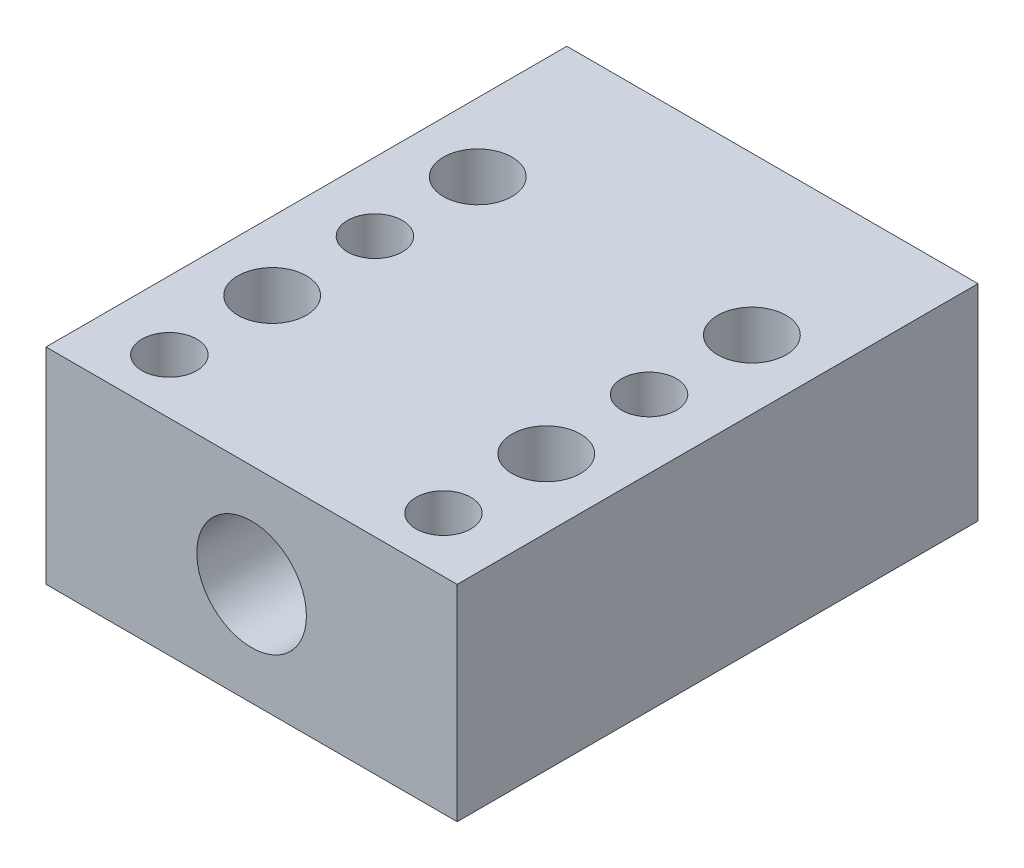
ISO-10303-21;
HEADER;
FILE_DESCRIPTION(('STEP AP214'),'2;1');
FILE_NAME('part.step','',(''),(''),'','','');
FILE_SCHEMA(('AUTOMOTIVE_DESIGN { 1 0 10303 214 1 1 1 1 }'));
ENDSEC;
DATA;
#1=APPLICATION_CONTEXT('core data for automotive mechanical design processes');
#2=APPLICATION_PROTOCOL_DEFINITION('international standard','automotive_design',2000,#1);
#3=PRODUCT_CONTEXT('',#1,'mechanical');
#4=PRODUCT('Part','Part','',(#3));
#5=PRODUCT_RELATED_PRODUCT_CATEGORY('part','',(#4));
#6=PRODUCT_DEFINITION_FORMATION('','',#4);
#7=PRODUCT_DEFINITION_CONTEXT('part definition',#1,'design');
#8=PRODUCT_DEFINITION('design','',#6,#7);
#9=PRODUCT_DEFINITION_SHAPE('','',#8);
#10=(LENGTH_UNIT() NAMED_UNIT(*) SI_UNIT(.MILLI.,.METRE.));
#11=(NAMED_UNIT(*) PLANE_ANGLE_UNIT() SI_UNIT($,.RADIAN.));
#12=(NAMED_UNIT(*) SI_UNIT($,.STERADIAN.) SOLID_ANGLE_UNIT());
#13=UNCERTAINTY_MEASURE_WITH_UNIT(LENGTH_MEASURE(1.E-05),#10,'distance_accuracy_value','');
#14=(GEOMETRIC_REPRESENTATION_CONTEXT(3) GLOBAL_UNCERTAINTY_ASSIGNED_CONTEXT((#13)) GLOBAL_UNIT_ASSIGNED_CONTEXT((#10,
#11,#12)) REPRESENTATION_CONTEXT('',''));
#15=CARTESIAN_POINT('',(0.,0.,0.));
#16=DIRECTION('',(0.,0.,1.));
#17=DIRECTION('',(1.,0.,0.));
#18=AXIS2_PLACEMENT_3D('',#15,#16,#17);
#19=CARTESIAN_POINT('',(0.,0.,38.));
#20=DIRECTION('',(0.,0.,1.));
#21=DIRECTION('',(1.,0.,0.));
#22=AXIS2_PLACEMENT_3D('',#19,#20,#21);
#23=PLANE('',#22);
#24=DIRECTION('',(0.,1.,0.));
#25=VECTOR('',#24,1.);
#26=CARTESIAN_POINT('',(15.,7.5,38.));
#27=LINE('',#26,#25);
#28=CARTESIAN_POINT('',(15.,-7.5,38.));
#29=VERTEX_POINT('',#28);
#30=CARTESIAN_POINT('',(15.,7.5,38.));
#31=VERTEX_POINT('',#30);
#32=EDGE_CURVE('E92',#29,#31,#27,.T.);
#33=ORIENTED_EDGE('',*,*,#32,.T.);
#34=DIRECTION('',(-1.,0.,0.));
#35=VECTOR('',#34,1.);
#36=CARTESIAN_POINT('',(-15.,7.5,38.));
#37=LINE('',#36,#35);
#38=CARTESIAN_POINT('',(-15.,7.5,38.));
#39=VERTEX_POINT('',#38);
#40=EDGE_CURVE('E87',#31,#39,#37,.T.);
#41=ORIENTED_EDGE('',*,*,#40,.T.);
#42=DIRECTION('',(0.,-1.,0.));
#43=VECTOR('',#42,1.);
#44=CARTESIAN_POINT('',(-15.,7.5,38.));
#45=LINE('',#44,#43);
#46=CARTESIAN_POINT('',(-15.,-7.5,38.));
#47=VERTEX_POINT('',#46);
#48=EDGE_CURVE('E90',#39,#47,#45,.T.);
#49=ORIENTED_EDGE('',*,*,#48,.T.);
#50=DIRECTION('',(1.,0.,0.));
#51=VECTOR('',#50,1.);
#52=CARTESIAN_POINT('',(-15.,-7.5,38.));
#53=LINE('',#52,#51);
#54=EDGE_CURVE('E57',#47,#29,#53,.T.);
#55=ORIENTED_EDGE('',*,*,#54,.T.);
#56=EDGE_LOOP('',(#33,#41,#49,#55));
#57=FACE_BOUND('',#56,.T.);
#58=CARTESIAN_POINT('',(0.,0.,38.));
#59=DIRECTION('',(0.,0.,1.));
#60=DIRECTION('',(1.,0.,0.));
#61=AXIS2_PLACEMENT_3D('',#58,#59,#60);
#62=CIRCLE('',#61,4.);
#63=CARTESIAN_POINT('',(4.,0.,38.));
#64=VERTEX_POINT('',#63);
#65=EDGE_CURVE('E112',#64,#64,#62,.T.);
#66=ORIENTED_EDGE('',*,*,#65,.F.);
#67=EDGE_LOOP('',(#66));
#68=FACE_BOUND('',#67,.T.);
#69=ADVANCED_FACE('F39',(#57,#68),#23,.T.);
#70=CARTESIAN_POINT('',(0.,0.,0.));
#71=DIRECTION('',(0.,0.,1.));
#72=DIRECTION('',(1.,0.,0.));
#73=AXIS2_PLACEMENT_3D('',#70,#71,#72);
#74=PLANE('',#73);
#75=DIRECTION('',(0.,1.,0.));
#76=VECTOR('',#75,1.);
#77=CARTESIAN_POINT('',(15.,7.5,0.));
#78=LINE('',#77,#76);
#79=CARTESIAN_POINT('',(15.,-7.5,0.));
#80=VERTEX_POINT('',#79);
#81=CARTESIAN_POINT('',(15.,7.5,0.));
#82=VERTEX_POINT('',#81);
#83=EDGE_CURVE('E108',#80,#82,#78,.T.);
#84=ORIENTED_EDGE('',*,*,#83,.F.);
#85=DIRECTION('',(1.,0.,0.));
#86=VECTOR('',#85,1.);
#87=CARTESIAN_POINT('',(-15.,-7.5,0.));
#88=LINE('',#87,#86);
#89=CARTESIAN_POINT('',(-15.,-7.5,0.));
#90=VERTEX_POINT('',#89);
#91=EDGE_CURVE('E80',#90,#80,#88,.T.);
#92=ORIENTED_EDGE('',*,*,#91,.F.);
#93=DIRECTION('',(0.,-1.,0.));
#94=VECTOR('',#93,1.);
#95=CARTESIAN_POINT('',(-15.,7.5,0.));
#96=LINE('',#95,#94);
#97=CARTESIAN_POINT('',(-15.,7.5,0.));
#98=VERTEX_POINT('',#97);
#99=EDGE_CURVE('E74',#98,#90,#96,.T.);
#100=ORIENTED_EDGE('',*,*,#99,.F.);
#101=DIRECTION('',(-1.,0.,0.));
#102=VECTOR('',#101,1.);
#103=CARTESIAN_POINT('',(-15.,7.5,0.));
#104=LINE('',#103,#102);
#105=EDGE_CURVE('E97',#82,#98,#104,.T.);
#106=ORIENTED_EDGE('',*,*,#105,.F.);
#107=EDGE_LOOP('',(#84,#92,#100,#106));
#108=FACE_BOUND('',#107,.T.);
#109=CARTESIAN_POINT('',(0.,0.,0.));
#110=DIRECTION('',(0.,0.,1.));
#111=DIRECTION('',(1.,0.,0.));
#112=AXIS2_PLACEMENT_3D('',#109,#110,#111);
#113=CIRCLE('',#112,4.);
#114=CARTESIAN_POINT('',(4.,0.,0.));
#115=VERTEX_POINT('',#114);
#116=EDGE_CURVE('E130',#115,#115,#113,.T.);
#117=ORIENTED_EDGE('',*,*,#116,.T.);
#118=EDGE_LOOP('',(#117));
#119=FACE_BOUND('',#118,.T.);
#120=ADVANCED_FACE('F125',(#108,#119),#74,.F.);
#121=CARTESIAN_POINT('',(15.,7.5,38.));
#122=DIRECTION('',(-1.,0.,0.));
#123=DIRECTION('',(0.,-1.,0.));
#124=AXIS2_PLACEMENT_3D('',#121,#122,#123);
#125=PLANE('',#124);
#126=ORIENTED_EDGE('',*,*,#83,.T.);
#127=DIRECTION('',(0.,0.,-1.));
#128=VECTOR('',#127,1.);
#129=CARTESIAN_POINT('',(15.,7.5,38.));
#130=LINE('',#129,#128);
#131=EDGE_CURVE('E11',#31,#82,#130,.T.);
#132=ORIENTED_EDGE('',*,*,#131,.F.);
#133=ORIENTED_EDGE('',*,*,#32,.F.);
#134=DIRECTION('',(0.,0.,-1.));
#135=VECTOR('',#134,1.);
#136=CARTESIAN_POINT('',(15.,-7.5,38.));
#137=LINE('',#136,#135);
#138=EDGE_CURVE('E104',#29,#80,#137,.T.);
#139=ORIENTED_EDGE('',*,*,#138,.T.);
#140=EDGE_LOOP('',(#126,#132,#133,#139));
#141=FACE_BOUND('',#140,.T.);
#142=ADVANCED_FACE('F41',(#141),#125,.F.);
#143=CARTESIAN_POINT('',(-15.,7.5,38.));
#144=DIRECTION('',(0.,-1.,0.));
#145=DIRECTION('',(0.,0.,-1.));
#146=AXIS2_PLACEMENT_3D('',#143,#144,#145);
#147=PLANE('',#146);
#148=CARTESIAN_POINT('',(-9.99999999999999,7.5,34.));
#149=DIRECTION('',(0.,1.,0.));
#150=DIRECTION('',(0.,0.,1.));
#151=AXIS2_PLACEMENT_3D('',#148,#149,#150);
#152=CIRCLE('',#151,2.);
#153=CARTESIAN_POINT('',(-9.99999999999999,7.5,36.));
#154=VERTEX_POINT('',#153);
#155=EDGE_CURVE('E162',#154,#154,#152,.T.);
#156=ORIENTED_EDGE('',*,*,#155,.F.);
#157=EDGE_LOOP('',(#156));
#158=FACE_BOUND('',#157,.T.);
#159=CARTESIAN_POINT('',(-9.99999999999999,7.5,26.5));
#160=DIRECTION('',(0.,1.,0.));
#161=DIRECTION('',(0.,0.,1.));
#162=AXIS2_PLACEMENT_3D('',#159,#160,#161);
#163=CIRCLE('',#162,2.5);
#164=CARTESIAN_POINT('',(-9.99999999999999,7.5,29.));
#165=VERTEX_POINT('',#164);
#166=EDGE_CURVE('E171',#165,#165,#163,.T.);
#167=ORIENTED_EDGE('',*,*,#166,.F.);
#168=EDGE_LOOP('',(#167));
#169=FACE_BOUND('',#168,.T.);
#170=CARTESIAN_POINT('',(10.,7.5,26.5));
#171=DIRECTION('',(0.,1.,0.));
#172=DIRECTION('',(0.,0.,1.));
#173=AXIS2_PLACEMENT_3D('',#170,#171,#172);
#174=CIRCLE('',#173,2.5);
#175=CARTESIAN_POINT('',(10.,7.5,29.));
#176=VERTEX_POINT('',#175);
#177=EDGE_CURVE('E146',#176,#176,#174,.T.);
#178=ORIENTED_EDGE('',*,*,#177,.F.);
#179=EDGE_LOOP('',(#178));
#180=FACE_BOUND('',#179,.T.);
#181=CARTESIAN_POINT('',(-10.,7.5,19.));
#182=DIRECTION('',(0.,1.,0.));
#183=DIRECTION('',(0.,0.,1.));
#184=AXIS2_PLACEMENT_3D('',#181,#182,#183);
#185=CIRCLE('',#184,2.);
#186=CARTESIAN_POINT('',(-10.,7.5,21.));
#187=VERTEX_POINT('',#186);
#188=EDGE_CURVE('E155',#187,#187,#185,.T.);
#189=ORIENTED_EDGE('',*,*,#188,.F.);
#190=EDGE_LOOP('',(#189));
#191=FACE_BOUND('',#190,.T.);
#192=CARTESIAN_POINT('',(10.,7.5,34.));
#193=DIRECTION('',(0.,1.,0.));
#194=DIRECTION('',(0.,0.,1.));
#195=AXIS2_PLACEMENT_3D('',#192,#193,#194);
#196=CIRCLE('',#195,2.);
#197=CARTESIAN_POINT('',(10.,7.5,36.));
#198=VERTEX_POINT('',#197);
#199=EDGE_CURVE('E194',#198,#198,#196,.T.);
#200=ORIENTED_EDGE('',*,*,#199,.F.);
#201=EDGE_LOOP('',(#200));
#202=FACE_BOUND('',#201,.T.);
#203=CARTESIAN_POINT('',(10.,7.5,11.5));
#204=DIRECTION('',(0.,1.,0.));
#205=DIRECTION('',(0.,0.,1.));
#206=AXIS2_PLACEMENT_3D('',#203,#204,#205);
#207=CIRCLE('',#206,2.5);
#208=CARTESIAN_POINT('',(10.,7.5,14.));
#209=VERTEX_POINT('',#208);
#210=EDGE_CURVE('E186',#209,#209,#207,.T.);
#211=ORIENTED_EDGE('',*,*,#210,.F.);
#212=EDGE_LOOP('',(#211));
#213=FACE_BOUND('',#212,.T.);
#214=CARTESIAN_POINT('',(-10.,7.5,11.5));
#215=DIRECTION('',(0.,1.,0.));
#216=DIRECTION('',(0.,0.,1.));
#217=AXIS2_PLACEMENT_3D('',#214,#215,#216);
#218=CIRCLE('',#217,2.5);
#219=CARTESIAN_POINT('',(-10.,7.5,14.));
#220=VERTEX_POINT('',#219);
#221=EDGE_CURVE('E178',#220,#220,#218,.T.);
#222=ORIENTED_EDGE('',*,*,#221,.F.);
#223=EDGE_LOOP('',(#222));
#224=FACE_BOUND('',#223,.T.);
#225=CARTESIAN_POINT('',(10.,7.5,19.));
#226=DIRECTION('',(0.,1.,0.));
#227=DIRECTION('',(0.,0.,1.));
#228=AXIS2_PLACEMENT_3D('',#225,#226,#227);
#229=CIRCLE('',#228,2.);
#230=CARTESIAN_POINT('',(10.,7.5,21.));
#231=VERTEX_POINT('',#230);
#232=EDGE_CURVE('E138',#231,#231,#229,.T.);
#233=ORIENTED_EDGE('',*,*,#232,.F.);
#234=EDGE_LOOP('',(#233));
#235=FACE_BOUND('',#234,.T.);
#236=ORIENTED_EDGE('',*,*,#105,.T.);
#237=DIRECTION('',(0.,0.,-1.));
#238=VECTOR('',#237,1.);
#239=CARTESIAN_POINT('',(-15.,7.5,38.));
#240=LINE('',#239,#238);
#241=EDGE_CURVE('E49',#39,#98,#240,.T.);
#242=ORIENTED_EDGE('',*,*,#241,.F.);
#243=ORIENTED_EDGE('',*,*,#40,.F.);
#244=ORIENTED_EDGE('',*,*,#131,.T.);
#245=EDGE_LOOP('',(#236,#242,#243,#244));
#246=FACE_BOUND('',#245,.T.);
#247=ADVANCED_FACE('F96',(#158,#169,#180,#191,#202,#213,#224,#235,#246),#147,.F.);
#248=CARTESIAN_POINT('',(-15.,7.5,38.));
#249=DIRECTION('',(1.,0.,0.));
#250=DIRECTION('',(0.,1.,0.));
#251=AXIS2_PLACEMENT_3D('',#248,#249,#250);
#252=PLANE('',#251);
#253=ORIENTED_EDGE('',*,*,#99,.T.);
#254=DIRECTION('',(0.,0.,-1.));
#255=VECTOR('',#254,1.);
#256=CARTESIAN_POINT('',(-15.,-7.5,38.));
#257=LINE('',#256,#255);
#258=EDGE_CURVE('E99',#47,#90,#257,.T.);
#259=ORIENTED_EDGE('',*,*,#258,.F.);
#260=ORIENTED_EDGE('',*,*,#48,.F.);
#261=ORIENTED_EDGE('',*,*,#241,.T.);
#262=EDGE_LOOP('',(#253,#259,#260,#261));
#263=FACE_BOUND('',#262,.T.);
#264=ADVANCED_FACE('F100',(#263),#252,.F.);
#265=CARTESIAN_POINT('',(-15.,-7.5,38.));
#266=DIRECTION('',(0.,1.,0.));
#267=DIRECTION('',(0.,0.,1.));
#268=AXIS2_PLACEMENT_3D('',#265,#266,#267);
#269=PLANE('',#268);
#270=ORIENTED_EDGE('',*,*,#91,.T.);
#271=ORIENTED_EDGE('',*,*,#138,.F.);
#272=ORIENTED_EDGE('',*,*,#54,.F.);
#273=ORIENTED_EDGE('',*,*,#258,.T.);
#274=EDGE_LOOP('',(#270,#271,#272,#273));
#275=FACE_BOUND('',#274,.T.);
#276=ADVANCED_FACE('F122',(#275),#269,.F.);
#277=CARTESIAN_POINT('',(0.,0.,38.));
#278=DIRECTION('',(0.,0.,-1.));
#279=DIRECTION('',(-1.,0.,0.));
#280=AXIS2_PLACEMENT_3D('',#277,#278,#279);
#281=CYLINDRICAL_SURFACE('',#280,4.);
#282=ORIENTED_EDGE('',*,*,#65,.T.);
#283=EDGE_LOOP('',(#282));
#284=FACE_BOUND('',#283,.T.);
#285=ORIENTED_EDGE('',*,*,#116,.F.);
#286=EDGE_LOOP('',(#285));
#287=FACE_BOUND('',#286,.T.);
#288=ADVANCED_FACE('F223',(#284,#287),#281,.F.);
#289=CARTESIAN_POINT('',(10.,1.5,19.));
#290=DIRECTION('',(0.,1.,0.));
#291=DIRECTION('',(0.,0.,1.));
#292=AXIS2_PLACEMENT_3D('',#289,#290,#291);
#293=CYLINDRICAL_SURFACE('',#292,2.);
#294=CARTESIAN_POINT('',(10.,1.5,19.));
#295=DIRECTION('',(0.,1.,0.));
#296=DIRECTION('',(0.,0.,1.));
#297=AXIS2_PLACEMENT_3D('',#294,#295,#296);
#298=CIRCLE('',#297,2.);
#299=CARTESIAN_POINT('',(10.,1.5,21.));
#300=VERTEX_POINT('',#299);
#301=EDGE_CURVE('E134',#300,#300,#298,.T.);
#302=ORIENTED_EDGE('',*,*,#301,.F.);
#303=EDGE_LOOP('',(#302));
#304=FACE_BOUND('',#303,.T.);
#305=ORIENTED_EDGE('',*,*,#232,.T.);
#306=EDGE_LOOP('',(#305));
#307=FACE_BOUND('',#306,.T.);
#308=ADVANCED_FACE('F220',(#304,#307),#293,.F.);
#309=CARTESIAN_POINT('',(10.,1.5,19.));
#310=DIRECTION('',(0.,1.,0.));
#311=DIRECTION('',(0.,0.,1.));
#312=AXIS2_PLACEMENT_3D('',#309,#310,#311);
#313=PLANE('',#312);
#314=ORIENTED_EDGE('',*,*,#301,.T.);
#315=EDGE_LOOP('',(#314));
#316=FACE_BOUND('',#315,.T.);
#317=ADVANCED_FACE('F222',(#316),#313,.T.);
#318=CARTESIAN_POINT('',(-10.,1.5,11.5));
#319=DIRECTION('',(0.,1.,0.));
#320=DIRECTION('',(0.,0.,1.));
#321=AXIS2_PLACEMENT_3D('',#318,#319,#320);
#322=CYLINDRICAL_SURFACE('',#321,2.5);
#323=CARTESIAN_POINT('',(-10.,1.5,11.5));
#324=DIRECTION('',(0.,1.,0.));
#325=DIRECTION('',(0.,0.,1.));
#326=AXIS2_PLACEMENT_3D('',#323,#324,#325);
#327=CIRCLE('',#326,2.5);
#328=CARTESIAN_POINT('',(-10.,1.5,14.));
#329=VERTEX_POINT('',#328);
#330=EDGE_CURVE('E182',#329,#329,#327,.T.);
#331=ORIENTED_EDGE('',*,*,#330,.F.);
#332=EDGE_LOOP('',(#331));
#333=FACE_BOUND('',#332,.T.);
#334=ORIENTED_EDGE('',*,*,#221,.T.);
#335=EDGE_LOOP('',(#334));
#336=FACE_BOUND('',#335,.T.);
#337=ADVANCED_FACE('F230',(#333,#336),#322,.F.);
#338=CARTESIAN_POINT('',(-10.,1.5,11.5));
#339=DIRECTION('',(0.,1.,0.));
#340=DIRECTION('',(0.,0.,1.));
#341=AXIS2_PLACEMENT_3D('',#338,#339,#340);
#342=PLANE('',#341);
#343=ORIENTED_EDGE('',*,*,#330,.T.);
#344=EDGE_LOOP('',(#343));
#345=FACE_BOUND('',#344,.T.);
#346=ADVANCED_FACE('F284',(#345),#342,.T.);
#347=CARTESIAN_POINT('',(10.,1.5,11.5));
#348=DIRECTION('',(0.,1.,0.));
#349=DIRECTION('',(0.,0.,1.));
#350=AXIS2_PLACEMENT_3D('',#347,#348,#349);
#351=CYLINDRICAL_SURFACE('',#350,2.5);
#352=CARTESIAN_POINT('',(10.,1.5,11.5));
#353=DIRECTION('',(0.,1.,0.));
#354=DIRECTION('',(0.,0.,1.));
#355=AXIS2_PLACEMENT_3D('',#352,#353,#354);
#356=CIRCLE('',#355,2.5);
#357=CARTESIAN_POINT('',(10.,1.5,14.));
#358=VERTEX_POINT('',#357);
#359=EDGE_CURVE('E190',#358,#358,#356,.T.);
#360=ORIENTED_EDGE('',*,*,#359,.F.);
#361=EDGE_LOOP('',(#360));
#362=FACE_BOUND('',#361,.T.);
#363=ORIENTED_EDGE('',*,*,#210,.T.);
#364=EDGE_LOOP('',(#363));
#365=FACE_BOUND('',#364,.T.);
#366=ADVANCED_FACE('F294',(#362,#365),#351,.F.);
#367=CARTESIAN_POINT('',(10.,1.5,11.5));
#368=DIRECTION('',(0.,1.,0.));
#369=DIRECTION('',(0.,0.,1.));
#370=AXIS2_PLACEMENT_3D('',#367,#368,#369);
#371=PLANE('',#370);
#372=ORIENTED_EDGE('',*,*,#359,.T.);
#373=EDGE_LOOP('',(#372));
#374=FACE_BOUND('',#373,.T.);
#375=ADVANCED_FACE('F207',(#374),#371,.T.);
#376=CARTESIAN_POINT('',(10.,1.5,34.));
#377=DIRECTION('',(0.,1.,0.));
#378=DIRECTION('',(0.,0.,1.));
#379=AXIS2_PLACEMENT_3D('',#376,#377,#378);
#380=CYLINDRICAL_SURFACE('',#379,2.);
#381=CARTESIAN_POINT('',(10.,1.5,34.));
#382=DIRECTION('',(0.,1.,0.));
#383=DIRECTION('',(0.,0.,1.));
#384=AXIS2_PLACEMENT_3D('',#381,#382,#383);
#385=CIRCLE('',#384,2.);
#386=CARTESIAN_POINT('',(10.,1.5,36.));
#387=VERTEX_POINT('',#386);
#388=EDGE_CURVE('E167',#387,#387,#385,.T.);
#389=ORIENTED_EDGE('',*,*,#388,.F.);
#390=EDGE_LOOP('',(#389));
#391=FACE_BOUND('',#390,.T.);
#392=ORIENTED_EDGE('',*,*,#199,.T.);
#393=EDGE_LOOP('',(#392));
#394=FACE_BOUND('',#393,.T.);
#395=ADVANCED_FACE('F204',(#391,#394),#380,.F.);
#396=CARTESIAN_POINT('',(10.,1.5,34.));
#397=DIRECTION('',(0.,1.,0.));
#398=DIRECTION('',(0.,0.,1.));
#399=AXIS2_PLACEMENT_3D('',#396,#397,#398);
#400=PLANE('',#399);
#401=ORIENTED_EDGE('',*,*,#388,.T.);
#402=EDGE_LOOP('',(#401));
#403=FACE_BOUND('',#402,.T.);
#404=ADVANCED_FACE('F202',(#403),#400,.T.);
#405=CARTESIAN_POINT('',(-10.,1.5,19.));
#406=DIRECTION('',(0.,1.,0.));
#407=DIRECTION('',(0.,0.,1.));
#408=AXIS2_PLACEMENT_3D('',#405,#406,#407);
#409=CYLINDRICAL_SURFACE('',#408,2.);
#410=CARTESIAN_POINT('',(-10.,1.5,19.));
#411=DIRECTION('',(0.,1.,0.));
#412=DIRECTION('',(0.,0.,1.));
#413=AXIS2_PLACEMENT_3D('',#410,#411,#412);
#414=CIRCLE('',#413,2.);
#415=CARTESIAN_POINT('',(-10.,1.5,21.));
#416=VERTEX_POINT('',#415);
#417=EDGE_CURVE('E142',#416,#416,#414,.T.);
#418=ORIENTED_EDGE('',*,*,#417,.F.);
#419=EDGE_LOOP('',(#418));
#420=FACE_BOUND('',#419,.T.);
#421=ORIENTED_EDGE('',*,*,#188,.T.);
#422=EDGE_LOOP('',(#421));
#423=FACE_BOUND('',#422,.T.);
#424=ADVANCED_FACE('F328',(#420,#423),#409,.F.);
#425=CARTESIAN_POINT('',(-10.,1.5,19.));
#426=DIRECTION('',(0.,1.,0.));
#427=DIRECTION('',(0.,0.,1.));
#428=AXIS2_PLACEMENT_3D('',#425,#426,#427);
#429=PLANE('',#428);
#430=ORIENTED_EDGE('',*,*,#417,.T.);
#431=EDGE_LOOP('',(#430));
#432=FACE_BOUND('',#431,.T.);
#433=ADVANCED_FACE('F337',(#432),#429,.T.);
#434=CARTESIAN_POINT('',(10.,1.5,26.5));
#435=DIRECTION('',(0.,1.,0.));
#436=DIRECTION('',(0.,0.,1.));
#437=AXIS2_PLACEMENT_3D('',#434,#435,#436);
#438=CYLINDRICAL_SURFACE('',#437,2.5);
#439=CARTESIAN_POINT('',(10.,1.5,26.5));
#440=DIRECTION('',(0.,1.,0.));
#441=DIRECTION('',(0.,0.,1.));
#442=AXIS2_PLACEMENT_3D('',#439,#440,#441);
#443=CIRCLE('',#442,2.5);
#444=CARTESIAN_POINT('',(10.,1.5,29.));
#445=VERTEX_POINT('',#444);
#446=EDGE_CURVE('E150',#445,#445,#443,.T.);
#447=ORIENTED_EDGE('',*,*,#446,.F.);
#448=EDGE_LOOP('',(#447));
#449=FACE_BOUND('',#448,.T.);
#450=ORIENTED_EDGE('',*,*,#177,.T.);
#451=EDGE_LOOP('',(#450));
#452=FACE_BOUND('',#451,.T.);
#453=ADVANCED_FACE('F347',(#449,#452),#438,.F.);
#454=CARTESIAN_POINT('',(10.,1.5,26.5));
#455=DIRECTION('',(0.,1.,0.));
#456=DIRECTION('',(0.,0.,1.));
#457=AXIS2_PLACEMENT_3D('',#454,#455,#456);
#458=PLANE('',#457);
#459=ORIENTED_EDGE('',*,*,#446,.T.);
#460=EDGE_LOOP('',(#459));
#461=FACE_BOUND('',#460,.T.);
#462=ADVANCED_FACE('F357',(#461),#458,.T.);
#463=CARTESIAN_POINT('',(-9.99999999999999,1.5,26.5));
#464=DIRECTION('',(0.,1.,0.));
#465=DIRECTION('',(0.,0.,1.));
#466=AXIS2_PLACEMENT_3D('',#463,#464,#465);
#467=CYLINDRICAL_SURFACE('',#466,2.5);
#468=CARTESIAN_POINT('',(-9.99999999999999,1.5,26.5));
#469=DIRECTION('',(0.,1.,0.));
#470=DIRECTION('',(0.,0.,1.));
#471=AXIS2_PLACEMENT_3D('',#468,#469,#470);
#472=CIRCLE('',#471,2.5);
#473=CARTESIAN_POINT('',(-9.99999999999999,1.5,29.));
#474=VERTEX_POINT('',#473);
#475=EDGE_CURVE('E151',#474,#474,#472,.T.);
#476=ORIENTED_EDGE('',*,*,#475,.F.);
#477=EDGE_LOOP('',(#476));
#478=FACE_BOUND('',#477,.T.);
#479=ORIENTED_EDGE('',*,*,#166,.T.);
#480=EDGE_LOOP('',(#479));
#481=FACE_BOUND('',#480,.T.);
#482=ADVANCED_FACE('F367',(#478,#481),#467,.F.);
#483=CARTESIAN_POINT('',(-9.99999999999999,1.5,26.5));
#484=DIRECTION('',(0.,1.,0.));
#485=DIRECTION('',(0.,0.,1.));
#486=AXIS2_PLACEMENT_3D('',#483,#484,#485);
#487=PLANE('',#486);
#488=ORIENTED_EDGE('',*,*,#475,.T.);
#489=EDGE_LOOP('',(#488));
#490=FACE_BOUND('',#489,.T.);
#491=ADVANCED_FACE('F377',(#490),#487,.T.);
#492=CARTESIAN_POINT('',(-9.99999999999999,1.5,34.));
#493=DIRECTION('',(0.,1.,0.));
#494=DIRECTION('',(0.,0.,1.));
#495=AXIS2_PLACEMENT_3D('',#492,#493,#494);
#496=CYLINDRICAL_SURFACE('',#495,2.);
#497=CARTESIAN_POINT('',(-9.99999999999999,1.5,34.));
#498=DIRECTION('',(0.,1.,0.));
#499=DIRECTION('',(0.,0.,1.));
#500=AXIS2_PLACEMENT_3D('',#497,#498,#499);
#501=CIRCLE('',#500,2.);
#502=CARTESIAN_POINT('',(-9.99999999999999,1.5,36.));
#503=VERTEX_POINT('',#502);
#504=EDGE_CURVE('E166',#503,#503,#501,.T.);
#505=ORIENTED_EDGE('',*,*,#504,.F.);
#506=EDGE_LOOP('',(#505));
#507=FACE_BOUND('',#506,.T.);
#508=ORIENTED_EDGE('',*,*,#155,.T.);
#509=EDGE_LOOP('',(#508));
#510=FACE_BOUND('',#509,.T.);
#511=ADVANCED_FACE('F387',(#507,#510),#496,.F.);
#512=CARTESIAN_POINT('',(-9.99999999999999,1.5,34.));
#513=DIRECTION('',(0.,1.,0.));
#514=DIRECTION('',(0.,0.,1.));
#515=AXIS2_PLACEMENT_3D('',#512,#513,#514);
#516=PLANE('',#515);
#517=ORIENTED_EDGE('',*,*,#504,.T.);
#518=EDGE_LOOP('',(#517));
#519=FACE_BOUND('',#518,.T.);
#520=ADVANCED_FACE('F397',(#519),#516,.T.);
#521=CLOSED_SHELL('',(#69,#120,#142,#247,#264,#276,#288,#308,#317,#337,#346,#366,#375,#395,#404,
#424,#433,#453,#462,#482,#491,#511,#520));
#522=MANIFOLD_SOLID_BREP('B2',#521);
#523=ADVANCED_BREP_SHAPE_REPRESENTATION('',(#18,#522),#14);
#524=SHAPE_DEFINITION_REPRESENTATION(#9,#523);
ENDSEC;
END-ISO-10303-21;
